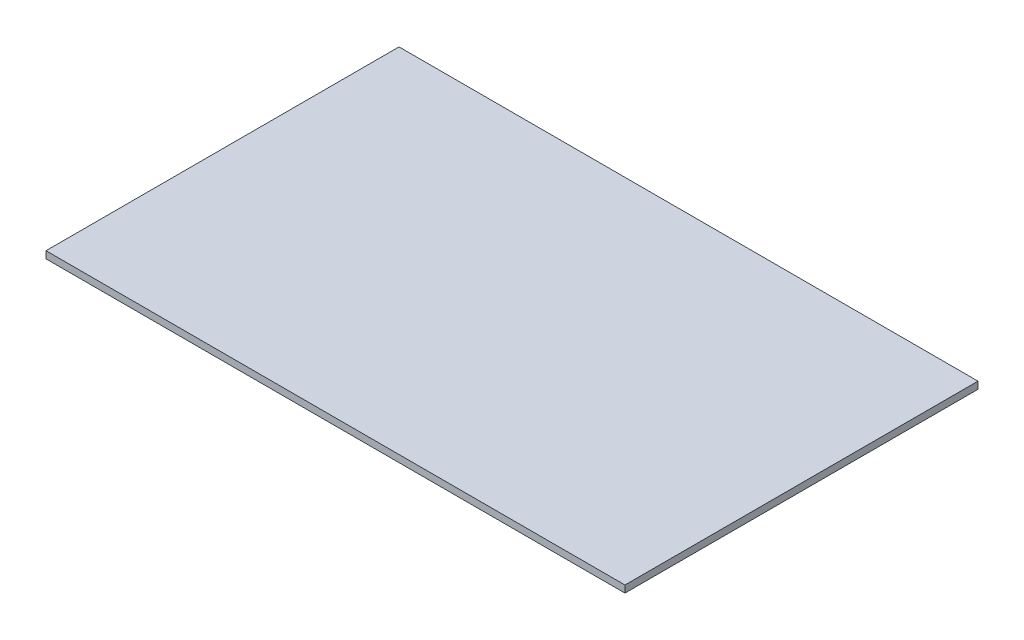
ISO-10303-21;
HEADER;
FILE_DESCRIPTION(('STEP AP214'),'2;1');
FILE_NAME('part.step','',(''),(''),'','','');
FILE_SCHEMA(('AUTOMOTIVE_DESIGN { 1 0 10303 214 1 1 1 1 }'));
ENDSEC;
DATA;
#1=APPLICATION_CONTEXT('core data for automotive mechanical design processes');
#2=APPLICATION_PROTOCOL_DEFINITION('international standard','automotive_design',2000,#1);
#3=PRODUCT_CONTEXT('',#1,'mechanical');
#4=PRODUCT('Part','Part','',(#3));
#5=PRODUCT_RELATED_PRODUCT_CATEGORY('part','',(#4));
#6=PRODUCT_DEFINITION_FORMATION('','',#4);
#7=PRODUCT_DEFINITION_CONTEXT('part definition',#1,'design');
#8=PRODUCT_DEFINITION('design','',#6,#7);
#9=PRODUCT_DEFINITION_SHAPE('','',#8);
#10=(LENGTH_UNIT() NAMED_UNIT(*) SI_UNIT(.MILLI.,.METRE.));
#11=(NAMED_UNIT(*) PLANE_ANGLE_UNIT() SI_UNIT($,.RADIAN.));
#12=(NAMED_UNIT(*) SI_UNIT($,.STERADIAN.) SOLID_ANGLE_UNIT());
#13=UNCERTAINTY_MEASURE_WITH_UNIT(LENGTH_MEASURE(1.E-05),#10,'distance_accuracy_value','');
#14=(GEOMETRIC_REPRESENTATION_CONTEXT(3) GLOBAL_UNCERTAINTY_ASSIGNED_CONTEXT((#13)) GLOBAL_UNIT_ASSIGNED_CONTEXT((#10,
#11,#12)) REPRESENTATION_CONTEXT('',''));
#15=CARTESIAN_POINT('',(0.,0.,0.));
#16=DIRECTION('',(0.,0.,1.));
#17=DIRECTION('',(1.,0.,0.));
#18=AXIS2_PLACEMENT_3D('',#15,#16,#17);
#19=CARTESIAN_POINT('',(41.,1.,25.));
#20=DIRECTION('',(-1.,0.,0.));
#21=DIRECTION('',(0.,0.,1.));
#22=AXIS2_PLACEMENT_3D('',#19,#20,#21);
#23=PLANE('',#22);
#24=DIRECTION('',(0.,0.,-1.));
#25=VECTOR('',#24,1.);
#26=CARTESIAN_POINT('',(41.,0.,25.));
#27=LINE('',#26,#25);
#28=CARTESIAN_POINT('',(41.,0.,25.));
#29=VERTEX_POINT('',#28);
#30=CARTESIAN_POINT('',(41.,0.,-25.));
#31=VERTEX_POINT('',#30);
#32=EDGE_CURVE('E98',#29,#31,#27,.T.);
#33=ORIENTED_EDGE('',*,*,#32,.T.);
#34=DIRECTION('',(0.,-1.,0.));
#35=VECTOR('',#34,1.);
#36=CARTESIAN_POINT('',(41.,1.,-25.));
#37=LINE('',#36,#35);
#38=CARTESIAN_POINT('',(41.,1.,-25.));
#39=VERTEX_POINT('',#38);
#40=EDGE_CURVE('E11',#39,#31,#37,.T.);
#41=ORIENTED_EDGE('',*,*,#40,.F.);
#42=DIRECTION('',(0.,0.,-1.));
#43=VECTOR('',#42,1.);
#44=CARTESIAN_POINT('',(41.,1.,25.));
#45=LINE('',#44,#43);
#46=CARTESIAN_POINT('',(41.,1.,25.));
#47=VERTEX_POINT('',#46);
#48=EDGE_CURVE('E86',#47,#39,#45,.T.);
#49=ORIENTED_EDGE('',*,*,#48,.F.);
#50=DIRECTION('',(0.,-1.,0.));
#51=VECTOR('',#50,1.);
#52=CARTESIAN_POINT('',(41.,1.,25.));
#53=LINE('',#52,#51);
#54=EDGE_CURVE('E94',#47,#29,#53,.T.);
#55=ORIENTED_EDGE('',*,*,#54,.T.);
#56=EDGE_LOOP('',(#33,#41,#49,#55));
#57=FACE_BOUND('',#56,.T.);
#58=ADVANCED_FACE('F35',(#57),#23,.F.);
#59=CARTESIAN_POINT('',(-41.,1.,-25.));
#60=DIRECTION('',(0.,0.,1.));
#61=DIRECTION('',(1.,0.,0.));
#62=AXIS2_PLACEMENT_3D('',#59,#60,#61);
#63=PLANE('',#62);
#64=DIRECTION('',(-1.,0.,0.));
#65=VECTOR('',#64,1.);
#66=CARTESIAN_POINT('',(-41.,0.,-25.));
#67=LINE('',#66,#65);
#68=CARTESIAN_POINT('',(-41.,0.,-25.));
#69=VERTEX_POINT('',#68);
#70=EDGE_CURVE('E90',#31,#69,#67,.T.);
#71=ORIENTED_EDGE('',*,*,#70,.T.);
#72=DIRECTION('',(0.,-1.,0.));
#73=VECTOR('',#72,1.);
#74=CARTESIAN_POINT('',(-41.,1.,-25.));
#75=LINE('',#74,#73);
#76=CARTESIAN_POINT('',(-41.,1.,-25.));
#77=VERTEX_POINT('',#76);
#78=EDGE_CURVE('E43',#77,#69,#75,.T.);
#79=ORIENTED_EDGE('',*,*,#78,.F.);
#80=DIRECTION('',(-1.,0.,0.));
#81=VECTOR('',#80,1.);
#82=CARTESIAN_POINT('',(-41.,1.,-25.));
#83=LINE('',#82,#81);
#84=EDGE_CURVE('E81',#39,#77,#83,.T.);
#85=ORIENTED_EDGE('',*,*,#84,.F.);
#86=ORIENTED_EDGE('',*,*,#40,.T.);
#87=EDGE_LOOP('',(#71,#79,#85,#86));
#88=FACE_BOUND('',#87,.T.);
#89=ADVANCED_FACE('F89',(#88),#63,.F.);
#90=CARTESIAN_POINT('',(-41.,1.,25.));
#91=DIRECTION('',(1.,0.,0.));
#92=DIRECTION('',(0.,0.,-1.));
#93=AXIS2_PLACEMENT_3D('',#90,#91,#92);
#94=PLANE('',#93);
#95=DIRECTION('',(0.,0.,1.));
#96=VECTOR('',#95,1.);
#97=CARTESIAN_POINT('',(-41.,0.,25.));
#98=LINE('',#97,#96);
#99=CARTESIAN_POINT('',(-41.,0.,25.));
#100=VERTEX_POINT('',#99);
#101=EDGE_CURVE('E68',#69,#100,#98,.T.);
#102=ORIENTED_EDGE('',*,*,#101,.T.);
#103=DIRECTION('',(0.,-1.,0.));
#104=VECTOR('',#103,1.);
#105=CARTESIAN_POINT('',(-41.,1.,25.));
#106=LINE('',#105,#104);
#107=CARTESIAN_POINT('',(-41.,1.,25.));
#108=VERTEX_POINT('',#107);
#109=EDGE_CURVE('E91',#108,#100,#106,.T.);
#110=ORIENTED_EDGE('',*,*,#109,.F.);
#111=DIRECTION('',(0.,0.,1.));
#112=VECTOR('',#111,1.);
#113=CARTESIAN_POINT('',(-41.,1.,25.));
#114=LINE('',#113,#112);
#115=EDGE_CURVE('E84',#77,#108,#114,.T.);
#116=ORIENTED_EDGE('',*,*,#115,.F.);
#117=ORIENTED_EDGE('',*,*,#78,.T.);
#118=EDGE_LOOP('',(#102,#110,#116,#117));
#119=FACE_BOUND('',#118,.T.);
#120=ADVANCED_FACE('F92',(#119),#94,.F.);
#121=CARTESIAN_POINT('',(-41.,1.,25.));
#122=DIRECTION('',(0.,0.,-1.));
#123=DIRECTION('',(-1.,0.,0.));
#124=AXIS2_PLACEMENT_3D('',#121,#122,#123);
#125=PLANE('',#124);
#126=DIRECTION('',(1.,0.,0.));
#127=VECTOR('',#126,1.);
#128=CARTESIAN_POINT('',(-41.,0.,25.));
#129=LINE('',#128,#127);
#130=EDGE_CURVE('E74',#100,#29,#129,.T.);
#131=ORIENTED_EDGE('',*,*,#130,.T.);
#132=ORIENTED_EDGE('',*,*,#54,.F.);
#133=DIRECTION('',(1.,0.,0.));
#134=VECTOR('',#133,1.);
#135=CARTESIAN_POINT('',(-41.,1.,25.));
#136=LINE('',#135,#134);
#137=EDGE_CURVE('E51',#108,#47,#136,.T.);
#138=ORIENTED_EDGE('',*,*,#137,.F.);
#139=ORIENTED_EDGE('',*,*,#109,.T.);
#140=EDGE_LOOP('',(#131,#132,#138,#139));
#141=FACE_BOUND('',#140,.T.);
#142=ADVANCED_FACE('F105',(#141),#125,.F.);
#143=CARTESIAN_POINT('',(0.,1.,0.));
#144=DIRECTION('',(0.,-1.,0.));
#145=DIRECTION('',(0.,0.,-1.));
#146=AXIS2_PLACEMENT_3D('',#143,#144,#145);
#147=PLANE('',#146);
#148=ORIENTED_EDGE('',*,*,#48,.T.);
#149=ORIENTED_EDGE('',*,*,#84,.T.);
#150=ORIENTED_EDGE('',*,*,#115,.T.);
#151=ORIENTED_EDGE('',*,*,#137,.T.);
#152=EDGE_LOOP('',(#148,#149,#150,#151));
#153=FACE_BOUND('',#152,.T.);
#154=ADVANCED_FACE('F82',(#153),#147,.F.);
#155=CARTESIAN_POINT('',(0.,0.,0.));
#156=DIRECTION('',(0.,-1.,0.));
#157=DIRECTION('',(0.,0.,-1.));
#158=AXIS2_PLACEMENT_3D('',#155,#156,#157);
#159=PLANE('',#158);
#160=ORIENTED_EDGE('',*,*,#32,.F.);
#161=ORIENTED_EDGE('',*,*,#130,.F.);
#162=ORIENTED_EDGE('',*,*,#101,.F.);
#163=ORIENTED_EDGE('',*,*,#70,.F.);
#164=EDGE_LOOP('',(#160,#161,#162,#163));
#165=FACE_BOUND('',#164,.T.);
#166=ADVANCED_FACE('F108',(#165),#159,.T.);
#167=CLOSED_SHELL('',(#58,#89,#120,#142,#154,#166));
#168=MANIFOLD_SOLID_BREP('B2',#167);
#169=ADVANCED_BREP_SHAPE_REPRESENTATION('',(#18,#168),#14);
#170=SHAPE_DEFINITION_REPRESENTATION(#9,#169);
ENDSEC;
END-ISO-10303-21;
